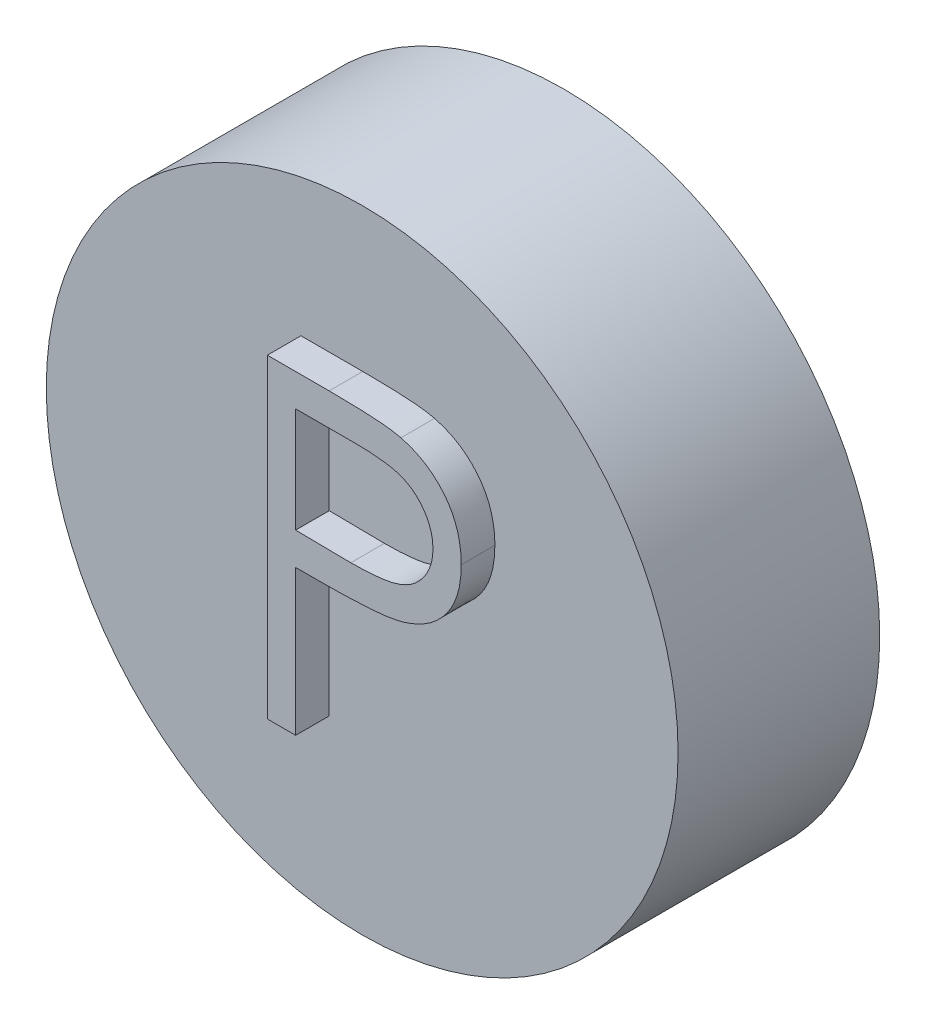
ISO-10303-21;
HEADER;
FILE_DESCRIPTION(('STEP AP214'),'2;1');
FILE_NAME('part.step','',(''),(''),'','','');
FILE_SCHEMA(('AUTOMOTIVE_DESIGN { 1 0 10303 214 1 1 1 1 }'));
ENDSEC;
DATA;
#1=APPLICATION_CONTEXT('core data for automotive mechanical design processes');
#2=APPLICATION_PROTOCOL_DEFINITION('international standard','automotive_design',2000,#1);
#3=PRODUCT_CONTEXT('',#1,'mechanical');
#4=PRODUCT('Part','Part','',(#3));
#5=PRODUCT_RELATED_PRODUCT_CATEGORY('part','',(#4));
#6=PRODUCT_DEFINITION_FORMATION('','',#4);
#7=PRODUCT_DEFINITION_CONTEXT('part definition',#1,'design');
#8=PRODUCT_DEFINITION('design','',#6,#7);
#9=PRODUCT_DEFINITION_SHAPE('','',#8);
#10=(LENGTH_UNIT() NAMED_UNIT(*) SI_UNIT(.MILLI.,.METRE.));
#11=(NAMED_UNIT(*) PLANE_ANGLE_UNIT() SI_UNIT($,.RADIAN.));
#12=(NAMED_UNIT(*) SI_UNIT($,.STERADIAN.) SOLID_ANGLE_UNIT());
#13=UNCERTAINTY_MEASURE_WITH_UNIT(LENGTH_MEASURE(1.E-05),#10,'distance_accuracy_value','');
#14=(GEOMETRIC_REPRESENTATION_CONTEXT(3) GLOBAL_UNCERTAINTY_ASSIGNED_CONTEXT((#13)) GLOBAL_UNIT_ASSIGNED_CONTEXT((#10,
#11,#12)) REPRESENTATION_CONTEXT('',''));
#15=CARTESIAN_POINT('',(0.,0.,0.));
#16=DIRECTION('',(0.,0.,1.));
#17=DIRECTION('',(1.,0.,0.));
#18=AXIS2_PLACEMENT_3D('',#15,#16,#17);
#19=CARTESIAN_POINT('',(0.,0.,7.62));
#20=DIRECTION('',(0.,0.,1.));
#21=DIRECTION('',(1.,0.,0.));
#22=AXIS2_PLACEMENT_3D('',#19,#20,#21);
#23=PLANE('',#22);
#24=CARTESIAN_POINT('',(0.,0.,7.62));
#25=DIRECTION('',(0.,0.,1.));
#26=DIRECTION('',(1.,0.,0.));
#27=AXIS2_PLACEMENT_3D('',#24,#25,#26);
#28=CIRCLE('',#27,11.938);
#29=CARTESIAN_POINT('',(11.938,0.,7.62));
#30=VERTEX_POINT('',#29);
#31=EDGE_CURVE('E313',#30,#30,#28,.T.);
#32=ORIENTED_EDGE('',*,*,#31,.T.);
#33=EDGE_LOOP('',(#32));
#34=FACE_BOUND('',#33,.T.);
#35=DIRECTION('',(-1.,0.,0.));
#36=VECTOR('',#35,1.);
#37=CARTESIAN_POINT('',(-1.24460796235766,-5.39100995542121,7.62));
#38=LINE('',#37,#36);
#39=CARTESIAN_POINT('',(-1.24460796235766,-5.39100995542121,7.62));
#40=VERTEX_POINT('',#39);
#41=CARTESIAN_POINT('',(-2.31311757774228,-5.39100995542121,7.62));
#42=VERTEX_POINT('',#41);
#43=EDGE_CURVE('E305',#40,#42,#38,.T.);
#44=ORIENTED_EDGE('',*,*,#43,.T.);
#45=DIRECTION('',(0.,1.,0.));
#46=VECTOR('',#45,1.);
#47=CARTESIAN_POINT('',(-2.31311757774228,-5.39100995542121,7.62));
#48=LINE('',#47,#46);
#49=CARTESIAN_POINT('',(-2.31311757774228,6.51524004457879,7.62));
#50=VERTEX_POINT('',#49);
#51=EDGE_CURVE('E55',#42,#50,#48,.T.);
#52=ORIENTED_EDGE('',*,*,#51,.T.);
#53=DIRECTION('',(1.,0.,0.));
#54=VECTOR('',#53,1.);
#55=CARTESIAN_POINT('',(-2.31311757774228,6.51524004457879,7.62));
#56=LINE('',#55,#54);
#57=CARTESIAN_POINT('',(0.0218621398057985,6.51524004457879,7.62));
#58=VERTEX_POINT('',#57);
#59=EDGE_CURVE('E257',#50,#58,#56,.T.);
#60=ORIENTED_EDGE('',*,*,#59,.T.);
#61=CARTESIAN_POINT('',(0.0218621398057985,6.51524004457879,7.62));
#62=CARTESIAN_POINT('',(0.182463525911005,6.51506350468806,7.62));
#63=CARTESIAN_POINT('',(0.490182913954527,6.51472524641733,7.62));
#64=CARTESIAN_POINT('',(0.931445737392795,6.50446972713545,7.62));
#65=CARTESIAN_POINT('',(1.3322091994431,6.49077178349845,7.62));
#66=CARTESIAN_POINT('',(1.69160915598847,6.47178337897543,7.62));
#67=CARTESIAN_POINT('',(2.01075141822943,6.44934319250846,7.62));
#68=CARTESIAN_POINT('',(2.28819187472264,6.41786973712632,7.62));
#69=CARTESIAN_POINT('',(2.52611125832258,6.38500748171723,7.62));
#70=CARTESIAN_POINT('',(2.66866801938618,6.35159716132536,7.62));
#71=CARTESIAN_POINT('',(2.73368230206541,6.3363600866461,7.62));
#72=B_SPLINE_CURVE_WITH_KNOTS('',3,(#61,#62,#63,#64,#65,#66,#67,#68,#69,#70,#71),.UNSPECIFIED.,
.F.,.F.,(4,1,1,1,1,1,1,1,4),(0.,0.176955752131251,0.339055079642581,0.486318224942077,
0.618780922835378,0.735618827767381,0.838742476720111,0.926457067876318,1.),.UNSPECIFIED.);
#73=CARTESIAN_POINT('',(2.73368230206541,6.3363600866461,7.62));
#74=VERTEX_POINT('',#73);
#75=EDGE_CURVE('E261',#58,#74,#72,.T.);
#76=ORIENTED_EDGE('',*,*,#75,.T.);
#77=CARTESIAN_POINT('',(2.73368230206541,6.3363600866461,7.62));
#78=CARTESIAN_POINT('',(2.81598351967431,6.31383363230791,7.62));
#79=CARTESIAN_POINT('',(2.9786466296549,6.26931153134824,7.62));
#80=CARTESIAN_POINT('',(3.21303321377739,6.18013806131056,7.62));
#81=CARTESIAN_POINT('',(3.43603334884902,6.0744031958475,7.62));
#82=CARTESIAN_POINT('',(3.64841213248843,5.953898543319,7.62));
#83=CARTESIAN_POINT('',(3.84755975436346,5.81345390086096,7.62));
#84=CARTESIAN_POINT('',(4.03644744729247,5.65876239765856,7.62));
#85=CARTESIAN_POINT('',(4.21340827311979,5.48625250813984,7.62));
#86=CARTESIAN_POINT('',(4.37744711515436,5.29785909848027,7.62));
#87=CARTESIAN_POINT('',(4.52809450693546,5.09674481307982,7.62));
#88=CARTESIAN_POINT('',(4.65780351692702,4.87990740598382,7.62));
#89=CARTESIAN_POINT('',(4.76641310174553,4.65099681131455,7.62));
#90=CARTESIAN_POINT('',(4.85956512349074,4.41017225228824,7.62));
#91=CARTESIAN_POINT('',(4.92660906235471,4.15541141969717,7.62));
#92=CARTESIAN_POINT('',(4.97711503367415,3.88848447849569,7.62));
#93=CARTESIAN_POINT('',(5.00917219547381,3.60942004129239,7.62));
#94=CARTESIAN_POINT('',(5.01224251715872,3.41871638481517,7.62));
#95=CARTESIAN_POINT('',(5.0138054991808,3.32163652895379,7.62));
#96=B_SPLINE_CURVE_WITH_KNOTS('',3,(#77,#78,#79,#80,#81,#82,#83,#84,#85,#86,#87,#88,#89,#90,#91,
#92,#93,#94,#95),.UNSPECIFIED.,.F.,.F.,(4,1,1,1,1,1,1,1,1,1,1,1,1,1,1,1,4),(0.,
0.0624813386352054,0.123490382687291,0.183411094206311,0.24315322099978,0.302126735372088,
0.361709670832907,0.42184229169488,0.482931901446669,0.544552254431324,0.605680719965358,
0.667679738343688,0.729984387538063,0.79455092128613,0.860345619712083,0.928907356265709,1.),.UNSPECIFIED.);
#97=CARTESIAN_POINT('',(5.0138054991808,3.32163652895379,7.62));
#98=VERTEX_POINT('',#97);
#99=EDGE_CURVE('E267',#74,#98,#96,.T.);
#100=ORIENTED_EDGE('',*,*,#99,.T.);
#101=CARTESIAN_POINT('',(5.0138054991808,3.32163652895379,7.62));
#102=CARTESIAN_POINT('',(5.01237190255818,3.22374069898922,7.62));
#103=CARTESIAN_POINT('',(5.00956697394041,3.03220089574615,7.62));
#104=CARTESIAN_POINT('',(4.97590193188427,2.75198632163997,7.62));
#105=CARTESIAN_POINT('',(4.93055547646704,2.48420322663874,7.62));
#106=CARTESIAN_POINT('',(4.86082889667541,2.22944536388116,7.62));
#107=CARTESIAN_POINT('',(4.76950566943887,1.98922564469042,7.62));
#108=CARTESIAN_POINT('',(4.66237645395488,1.75987306076273,7.62));
#109=CARTESIAN_POINT('',(4.53316462296484,1.54528953403625,7.62));
#110=CARTESIAN_POINT('',(4.38469426475322,1.34469603597045,7.62));
#111=CARTESIAN_POINT('',(4.21953214454168,1.15790428068743,7.62));
#112=CARTESIAN_POINT('',(4.03837706030859,0.986267881564923,7.62));
#113=CARTESIAN_POINT('',(3.84196035992822,0.830791516038288,7.62));
#114=CARTESIAN_POINT('',(3.63090626691845,0.691126632625541,7.62));
#115=CARTESIAN_POINT('',(3.40315722757272,0.570511967548589,7.62));
#116=CARTESIAN_POINT('',(3.16216740158584,0.462480421328694,7.62));
#117=CARTESIAN_POINT('',(2.90584211179341,0.371751188263816,7.62));
#118=CARTESIAN_POINT('',(2.72846445264505,0.324023925732946,7.62));
#119=CARTESIAN_POINT('',(2.63827965783464,0.299757772944173,7.62));
#120=B_SPLINE_CURVE_WITH_KNOTS('',3,(#101,#102,#103,#104,#105,#106,#107,#108,#109,#110,#111,
#112,#113,#114,#115,#116,#117,#118,#119),.UNSPECIFIED.,.F.,.F.,(4,1,1,1,1,1,1,1,1,1,1,1,1,1,1,1,
4),(0.,0.0701188944197149,0.137192352785971,0.202016180724751,0.264631406974743,
0.326116547145818,0.386010304667641,0.44581184695768,0.50529769673096,0.564633277726488,
0.62428262533384,0.683902031903751,0.74395277093827,0.805387731007634,0.86838803089628,
0.933084028252477,1.),.UNSPECIFIED.);
#121=CARTESIAN_POINT('',(2.63827965783464,0.299757772944173,7.62));
#122=VERTEX_POINT('',#121);
#123=EDGE_CURVE('E276',#98,#122,#120,.T.);
#124=ORIENTED_EDGE('',*,*,#123,.T.);
#125=CARTESIAN_POINT('',(2.63827965783465,0.299757772944173,7.62));
#126=CARTESIAN_POINT('',(2.56368756631028,0.283895310527416,7.62));
#127=CARTESIAN_POINT('',(2.40021466073535,0.249131801851788,7.62));
#128=CARTESIAN_POINT('',(2.13098807904141,0.210322676334818,7.62));
#129=CARTESIAN_POINT('',(1.81752922154801,0.177197445431641,7.62));
#130=CARTESIAN_POINT('',(1.46026593004951,0.152360539910368,7.62));
#131=CARTESIAN_POINT('',(1.05951888741451,0.131098125767283,7.62));
#132=CARTESIAN_POINT('',(0.615071306676725,0.114197734942748,7.62));
#133=CARTESIAN_POINT('',(0.126050740557823,0.104911357164217,7.62));
#134=CARTESIAN_POINT('',(-0.215050545100232,0.104432410233636,7.62));
#135=CARTESIAN_POINT('',(-0.393139362598047,0.104182352271096,7.62));
#136=B_SPLINE_CURVE_WITH_KNOTS('',3,(#125,#126,#127,#128,#129,#130,#131,#132,#133,#134,#135),
.UNSPECIFIED.,.F.,.F.,(4,1,1,1,1,1,1,1,4),(0.,0.0751731173762219,0.164746257511801,
0.26801688098778,0.385911875652956,0.517789479273397,0.663690977002281,0.824413220536641,1.),.UNSPECIFIED.);
#137=CARTESIAN_POINT('',(-0.393139362598047,0.104182352271096,7.62));
#138=VERTEX_POINT('',#137);
#139=EDGE_CURVE('E285',#122,#138,#136,.T.);
#140=ORIENTED_EDGE('',*,*,#139,.T.);
#141=DIRECTION('',(-1.,0.,0.));
#142=VECTOR('',#141,1.);
#143=CARTESIAN_POINT('',(-0.393139362598047,0.104182352271096,7.62));
#144=LINE('',#143,#142);
#145=CARTESIAN_POINT('',(-1.24460796235766,0.104182352271096,7.62));
#146=VERTEX_POINT('',#145);
#147=EDGE_CURVE('E294',#138,#146,#144,.T.);
#148=ORIENTED_EDGE('',*,*,#147,.T.);
#149=DIRECTION('',(0.,-1.,0.));
#150=VECTOR('',#149,1.);
#151=CARTESIAN_POINT('',(-1.24460796235766,0.104182352271096,7.62));
#152=LINE('',#151,#150);
#153=EDGE_CURVE('E301',#146,#40,#152,.T.);
#154=ORIENTED_EDGE('',*,*,#153,.T.);
#155=EDGE_LOOP('',(#44,#52,#60,#76,#100,#124,#140,#148,#154));
#156=FACE_BOUND('',#155,.T.);
#157=ADVANCED_FACE('F39',(#34,#156),#23,.T.);
#158=CARTESIAN_POINT('',(0.,0.,0.));
#159=DIRECTION('',(0.,0.,1.));
#160=DIRECTION('',(1.,0.,0.));
#161=AXIS2_PLACEMENT_3D('',#158,#159,#160);
#162=PLANE('',#161);
#163=CARTESIAN_POINT('',(0.,0.,0.));
#164=DIRECTION('',(0.,0.,1.));
#165=DIRECTION('',(1.,0.,0.));
#166=AXIS2_PLACEMENT_3D('',#163,#164,#165);
#167=CIRCLE('',#166,11.938);
#168=CARTESIAN_POINT('',(11.938,0.,0.));
#169=VERTEX_POINT('',#168);
#170=EDGE_CURVE('E11',#169,#169,#167,.T.);
#171=ORIENTED_EDGE('',*,*,#170,.F.);
#172=EDGE_LOOP('',(#171));
#173=FACE_BOUND('',#172,.T.);
#174=CARTESIAN_POINT('',(0.,0.,0.));
#175=DIRECTION('',(0.,0.,1.));
#176=DIRECTION('',(1.,0.,0.));
#177=AXIS2_PLACEMENT_3D('',#174,#175,#176);
#178=CIRCLE('',#177,8.763);
#179=CARTESIAN_POINT('',(8.763,0.,0.));
#180=VERTEX_POINT('',#179);
#181=EDGE_CURVE('E48',#180,#180,#178,.T.);
#182=ORIENTED_EDGE('',*,*,#181,.T.);
#183=EDGE_LOOP('',(#182));
#184=FACE_BOUND('',#183,.T.);
#185=ADVANCED_FACE('F347',(#173,#184),#162,.F.);
#186=CARTESIAN_POINT('',(0.,0.,5.08));
#187=DIRECTION('',(0.,0.,-1.));
#188=DIRECTION('',(-1.,0.,0.));
#189=AXIS2_PLACEMENT_3D('',#186,#187,#188);
#190=CYLINDRICAL_SURFACE('',#189,11.938);
#191=ORIENTED_EDGE('',*,*,#170,.T.);
#192=EDGE_LOOP('',(#191));
#193=FACE_BOUND('',#192,.T.);
#194=ORIENTED_EDGE('',*,*,#31,.F.);
#195=EDGE_LOOP('',(#194));
#196=FACE_BOUND('',#195,.T.);
#197=ADVANCED_FACE('F41',(#193,#196),#190,.T.);
#198=CARTESIAN_POINT('',(0.,0.,5.08));
#199=DIRECTION('',(0.,0.,-1.));
#200=DIRECTION('',(-1.,0.,0.));
#201=AXIS2_PLACEMENT_3D('',#198,#199,#200);
#202=CYLINDRICAL_SURFACE('',#201,8.763);
#203=CARTESIAN_POINT('',(0.,0.,5.08));
#204=DIRECTION('',(0.,0.,1.));
#205=DIRECTION('',(1.,0.,0.));
#206=AXIS2_PLACEMENT_3D('',#203,#204,#205);
#207=CIRCLE('',#206,8.763);
#208=CARTESIAN_POINT('',(8.763,0.,5.08));
#209=VERTEX_POINT('',#208);
#210=EDGE_CURVE('E340',#209,#209,#207,.T.);
#211=ORIENTED_EDGE('',*,*,#210,.T.);
#212=EDGE_LOOP('',(#211));
#213=FACE_BOUND('',#212,.T.);
#214=ORIENTED_EDGE('',*,*,#181,.F.);
#215=EDGE_LOOP('',(#214));
#216=FACE_BOUND('',#215,.T.);
#217=ADVANCED_FACE('F349',(#213,#216),#202,.F.);
#218=CARTESIAN_POINT('',(0.,0.,5.08));
#219=DIRECTION('',(0.,0.,1.));
#220=DIRECTION('',(1.,0.,0.));
#221=AXIS2_PLACEMENT_3D('',#218,#219,#220);
#222=PLANE('',#221);
#223=ORIENTED_EDGE('',*,*,#210,.F.);
#224=EDGE_LOOP('',(#223));
#225=FACE_BOUND('',#224,.T.);
#226=ADVANCED_FACE('F205',(#225),#222,.F.);
#227=CARTESIAN_POINT('',(1.38278616718824,6.48733310506139,8.89));
#228=DIRECTION('',(0.,1.77547699850606E-13,1.));
#229=DIRECTION('',(0.,-1.,1.77547699850606E-13));
#230=AXIS2_PLACEMENT_3D('',#227,#228,#229);
#231=PLANE('',#230);
#232=DIRECTION('',(0.,1.,0.));
#233=VECTOR('',#232,1.);
#234=CARTESIAN_POINT('',(-2.31311757774228,-5.39100995542121,8.89));
#235=LINE('',#234,#233);
#236=CARTESIAN_POINT('',(-2.31311757774228,-5.39100995542121,8.89));
#237=VERTEX_POINT('',#236);
#238=CARTESIAN_POINT('',(-2.31311757774228,6.51524004457879,8.89));
#239=VERTEX_POINT('',#238);
#240=EDGE_CURVE('E309',#237,#239,#235,.T.);
#241=ORIENTED_EDGE('',*,*,#240,.F.);
#242=DIRECTION('',(-1.,0.,0.));
#243=VECTOR('',#242,1.);
#244=CARTESIAN_POINT('',(-1.24460796235766,-5.39100995542121,8.89));
#245=LINE('',#244,#243);
#246=CARTESIAN_POINT('',(-1.24460796235766,-5.39100995542121,8.89));
#247=VERTEX_POINT('',#246);
#248=EDGE_CURVE('E250',#247,#237,#245,.T.);
#249=ORIENTED_EDGE('',*,*,#248,.F.);
#250=DIRECTION('',(0.,-1.,0.));
#251=VECTOR('',#250,1.);
#252=CARTESIAN_POINT('',(-1.24460796235766,0.104182352271096,8.89));
#253=LINE('',#252,#251);
#254=CARTESIAN_POINT('',(-1.24460796235766,0.104182352271096,8.89));
#255=VERTEX_POINT('',#254);
#256=EDGE_CURVE('E246',#255,#247,#253,.T.);
#257=ORIENTED_EDGE('',*,*,#256,.F.);
#258=DIRECTION('',(-1.,0.,0.));
#259=VECTOR('',#258,1.);
#260=CARTESIAN_POINT('',(-0.393139362598047,0.104182352271096,8.89));
#261=LINE('',#260,#259);
#262=CARTESIAN_POINT('',(-0.393139362598047,0.104182352271096,8.89));
#263=VERTEX_POINT('',#262);
#264=EDGE_CURVE('E234',#263,#255,#261,.T.);
#265=ORIENTED_EDGE('',*,*,#264,.F.);
#266=CARTESIAN_POINT('',(2.63827965783465,0.299757772944173,8.89));
#267=CARTESIAN_POINT('',(2.56368756631028,0.283895310527416,8.89));
#268=CARTESIAN_POINT('',(2.40021466073535,0.249131801851788,8.89));
#269=CARTESIAN_POINT('',(2.13098807904141,0.210322676334818,8.89));
#270=CARTESIAN_POINT('',(1.81752922154801,0.177197445431641,8.89));
#271=CARTESIAN_POINT('',(1.46026593004951,0.152360539910368,8.89));
#272=CARTESIAN_POINT('',(1.05951888741451,0.131098125767283,8.89));
#273=CARTESIAN_POINT('',(0.615071306676725,0.114197734942748,8.89));
#274=CARTESIAN_POINT('',(0.126050740557823,0.104911357164217,8.89));
#275=CARTESIAN_POINT('',(-0.215050545100232,0.104432410233636,8.89));
#276=CARTESIAN_POINT('',(-0.393139362598047,0.104182352271096,8.89));
#277=B_SPLINE_CURVE_WITH_KNOTS('',3,(#266,#267,#268,#269,#270,#271,#272,#273,#274,#275,#276),
.UNSPECIFIED.,.F.,.F.,(4,1,1,1,1,1,1,1,4),(0.,0.0751731173762219,0.164746257511801,
0.26801688098778,0.385911875652956,0.517789479273397,0.663690977002281,0.824413220536641,1.),.UNSPECIFIED.);
#278=CARTESIAN_POINT('',(2.63827965783464,0.299757772944173,8.89));
#279=VERTEX_POINT('',#278);
#280=EDGE_CURVE('E227',#279,#263,#277,.T.);
#281=ORIENTED_EDGE('',*,*,#280,.F.);
#282=CARTESIAN_POINT('',(5.0138054991808,3.32163652895379,8.89));
#283=CARTESIAN_POINT('',(5.01237190255818,3.22374069898922,8.89));
#284=CARTESIAN_POINT('',(5.00956697394041,3.03220089574615,8.89));
#285=CARTESIAN_POINT('',(4.97590193188427,2.75198632163997,8.89));
#286=CARTESIAN_POINT('',(4.93055547646704,2.48420322663874,8.89));
#287=CARTESIAN_POINT('',(4.86082889667541,2.22944536388116,8.89));
#288=CARTESIAN_POINT('',(4.76950566943887,1.98922564469042,8.89));
#289=CARTESIAN_POINT('',(4.66237645395488,1.75987306076273,8.89));
#290=CARTESIAN_POINT('',(4.53316462296484,1.54528953403625,8.89));
#291=CARTESIAN_POINT('',(4.38469426475322,1.34469603597045,8.89));
#292=CARTESIAN_POINT('',(4.21953214454168,1.15790428068743,8.89));
#293=CARTESIAN_POINT('',(4.03837706030859,0.986267881564923,8.89));
#294=CARTESIAN_POINT('',(3.84196035992822,0.830791516038288,8.89));
#295=CARTESIAN_POINT('',(3.63090626691845,0.691126632625541,8.89));
#296=CARTESIAN_POINT('',(3.40315722757272,0.570511967548589,8.89));
#297=CARTESIAN_POINT('',(3.16216740158584,0.462480421328694,8.89));
#298=CARTESIAN_POINT('',(2.90584211179341,0.371751188263816,8.89));
#299=CARTESIAN_POINT('',(2.72846445264505,0.324023925732946,8.89));
#300=CARTESIAN_POINT('',(2.63827965783464,0.299757772944173,8.89));
#301=B_SPLINE_CURVE_WITH_KNOTS('',3,(#282,#283,#284,#285,#286,#287,#288,#289,#290,#291,#292,
#293,#294,#295,#296,#297,#298,#299,#300),.UNSPECIFIED.,.F.,.F.,(4,1,1,1,1,1,1,1,1,1,1,1,1,1,1,1,
4),(0.,0.0701188944197149,0.137192352785971,0.202016180724751,0.264631406974743,
0.326116547145818,0.386010304667641,0.44581184695768,0.50529769673096,0.564633277726488,
0.62428262533384,0.683902031903751,0.74395277093827,0.805387731007634,0.86838803089628,
0.933084028252477,1.),.UNSPECIFIED.);
#302=CARTESIAN_POINT('',(5.0138054991808,3.32163652895379,8.89));
#303=VERTEX_POINT('',#302);
#304=EDGE_CURVE('E235',#303,#279,#301,.T.);
#305=ORIENTED_EDGE('',*,*,#304,.F.);
#306=CARTESIAN_POINT('',(2.73368230206541,6.3363600866461,8.89));
#307=CARTESIAN_POINT('',(2.81598351967431,6.31383363230791,8.89));
#308=CARTESIAN_POINT('',(2.9786466296549,6.26931153134824,8.89));
#309=CARTESIAN_POINT('',(3.21303321377739,6.18013806131056,8.89));
#310=CARTESIAN_POINT('',(3.43603334884902,6.0744031958475,8.89));
#311=CARTESIAN_POINT('',(3.64841213248843,5.953898543319,8.89));
#312=CARTESIAN_POINT('',(3.84755975436346,5.81345390086096,8.89));
#313=CARTESIAN_POINT('',(4.03644744729247,5.65876239765856,8.89));
#314=CARTESIAN_POINT('',(4.21340827311979,5.48625250813984,8.89));
#315=CARTESIAN_POINT('',(4.37744711515436,5.29785909848027,8.89));
#316=CARTESIAN_POINT('',(4.52809450693546,5.09674481307982,8.89));
#317=CARTESIAN_POINT('',(4.65780351692702,4.87990740598382,8.89));
#318=CARTESIAN_POINT('',(4.76641310174553,4.65099681131455,8.89));
#319=CARTESIAN_POINT('',(4.85956512349074,4.41017225228824,8.89));
#320=CARTESIAN_POINT('',(4.92660906235471,4.15541141969717,8.89));
#321=CARTESIAN_POINT('',(4.97711503367415,3.88848447849569,8.89));
#322=CARTESIAN_POINT('',(5.00917219547381,3.60942004129239,8.89));
#323=CARTESIAN_POINT('',(5.01224251715872,3.41871638481517,8.89));
#324=CARTESIAN_POINT('',(5.0138054991808,3.32163652895379,8.89));
#325=B_SPLINE_CURVE_WITH_KNOTS('',3,(#306,#307,#308,#309,#310,#311,#312,#313,#314,#315,#316,
#317,#318,#319,#320,#321,#322,#323,#324),.UNSPECIFIED.,.F.,.F.,(4,1,1,1,1,1,1,1,1,1,1,1,1,1,1,1,
4),(0.,0.0624813386352054,0.123490382687291,0.183411094206311,0.24315322099978,
0.302126735372088,0.361709670832907,0.42184229169488,0.482931901446669,0.544552254431324,
0.605680719965358,0.667679738343688,0.729984387538063,0.79455092128613,0.860345619712083,
0.928907356265709,1.),.UNSPECIFIED.);
#326=CARTESIAN_POINT('',(2.73368230206541,6.3363600866461,8.89));
#327=VERTEX_POINT('',#326);
#328=EDGE_CURVE('E418',#327,#303,#325,.T.);
#329=ORIENTED_EDGE('',*,*,#328,.F.);
#330=CARTESIAN_POINT('',(0.0218621398057985,6.51524004457879,8.89));
#331=CARTESIAN_POINT('',(0.182463525911005,6.51506350468806,8.89));
#332=CARTESIAN_POINT('',(0.490182913954527,6.51472524641733,8.89));
#333=CARTESIAN_POINT('',(0.931445737392795,6.50446972713545,8.89));
#334=CARTESIAN_POINT('',(1.3322091994431,6.49077178349845,8.89));
#335=CARTESIAN_POINT('',(1.69160915598847,6.47178337897543,8.89));
#336=CARTESIAN_POINT('',(2.01075141822943,6.44934319250846,8.89));
#337=CARTESIAN_POINT('',(2.28819187472264,6.41786973712632,8.89));
#338=CARTESIAN_POINT('',(2.52611125832258,6.38500748171723,8.89));
#339=CARTESIAN_POINT('',(2.66866801938618,6.35159716132536,8.89));
#340=CARTESIAN_POINT('',(2.73368230206541,6.3363600866461,8.89));
#341=B_SPLINE_CURVE_WITH_KNOTS('',3,(#330,#331,#332,#333,#334,#335,#336,#337,#338,#339,#340),
.UNSPECIFIED.,.F.,.F.,(4,1,1,1,1,1,1,1,4),(0.,0.176955752131251,0.339055079642581,
0.486318224942077,0.618780922835378,0.735618827767381,0.838742476720111,0.926457067876318,1.),.UNSPECIFIED.);
#342=CARTESIAN_POINT('',(0.0218621398057985,6.51524004457879,8.89));
#343=VERTEX_POINT('',#342);
#344=EDGE_CURVE('E412',#343,#327,#341,.T.);
#345=ORIENTED_EDGE('',*,*,#344,.F.);
#346=DIRECTION('',(1.,0.,0.));
#347=VECTOR('',#346,1.);
#348=CARTESIAN_POINT('',(-2.31311757774228,6.51524004457879,8.89));
#349=LINE('',#348,#347);
#350=EDGE_CURVE('E408',#239,#343,#349,.T.);
#351=ORIENTED_EDGE('',*,*,#350,.F.);
#352=EDGE_LOOP('',(#241,#249,#257,#265,#281,#305,#329,#345,#351));
#353=FACE_BOUND('',#352,.T.);
#354=DIRECTION('',(0.,-1.,0.));
#355=VECTOR('',#354,1.);
#356=CARTESIAN_POINT('',(-1.24460796235766,5.29408619842494,8.89));
#357=LINE('',#356,#355);
#358=CARTESIAN_POINT('',(-1.24460796235766,5.29408619842494,8.89));
#359=VERTEX_POINT('',#358);
#360=CARTESIAN_POINT('',(-1.24460796235766,1.32533619842494,8.89));
#361=VERTEX_POINT('',#360);
#362=EDGE_CURVE('E151',#359,#361,#357,.T.);
#363=ORIENTED_EDGE('',*,*,#362,.F.);
#364=DIRECTION('',(-1.,0.,0.));
#365=VECTOR('',#364,1.);
#366=CARTESIAN_POINT('',(0.932957392209645,5.29408619842494,8.89));
#367=LINE('',#366,#365);
#368=CARTESIAN_POINT('',(0.932957392209645,5.29408619842494,8.89));
#369=VERTEX_POINT('',#368);
#370=EDGE_CURVE('E142',#369,#359,#367,.T.);
#371=ORIENTED_EDGE('',*,*,#370,.F.);
#372=CARTESIAN_POINT('',(3.94529588379618,3.31686639674225,8.89));
#373=CARTESIAN_POINT('',(3.94100063098548,3.41258758981382,8.89));
#374=CARTESIAN_POINT('',(3.93246220000242,3.60286947464752,8.89));
#375=CARTESIAN_POINT('',(3.86899895121477,3.88174365136451,8.89));
#376=CARTESIAN_POINT('',(3.76235530316112,4.14788475289456,8.89));
#377=CARTESIAN_POINT('',(3.614525280749,4.39612355217718,8.89));
#378=CARTESIAN_POINT('',(3.43511125829363,4.62128367995184,8.89));
#379=CARTESIAN_POINT('',(3.2265840286138,4.81687658540675,8.89));
#380=CARTESIAN_POINT('',(2.98943445211265,4.9741129134474,8.89));
#381=CARTESIAN_POINT('',(2.76883466618879,5.07559934477016,8.89));
#382=CARTESIAN_POINT('',(2.57288777443469,5.1375638085204,8.89));
#383=CARTESIAN_POINT('',(2.40268976804431,5.18091902471867,8.89));
#384=CARTESIAN_POINT('',(2.2105205985863,5.21553425667687,8.89));
#385=CARTESIAN_POINT('',(1.99631770578766,5.24356327958176,8.89));
#386=CARTESIAN_POINT('',(1.76174133339091,5.26755764320767,8.89));
#387=CARTESIAN_POINT('',(1.50477617290119,5.28383851219116,8.89));
#388=CARTESIAN_POINT('',(1.22639565429631,5.2933684659958,8.89));
#389=CARTESIAN_POINT('',(1.03313826590751,5.2938411620029,8.89));
#390=CARTESIAN_POINT('',(0.932957392209645,5.29408619842494,8.89));
#391=B_SPLINE_CURVE_WITH_KNOTS('',3,(#372,#373,#374,#375,#376,#377,#378,#379,#380,#381,#382,
#383,#384,#385,#386,#387,#388,#389,#390),.UNSPECIFIED.,.F.,.F.,(4,1,1,1,1,1,1,1,1,1,1,1,1,1,1,1,
4),(0.,0.0700437554181561,0.139238316762646,0.208197455044138,0.279173374424568,
0.349986811686477,0.418353845662656,0.487609583757151,0.557411073108388,0.595330156763241,
0.63796405156522,0.685912777711293,0.738185164652479,0.796102647184943,0.858516543946927,
0.926657726468519,1.),.UNSPECIFIED.);
#392=CARTESIAN_POINT('',(3.94529588379618,3.31686639674225,8.89));
#393=VERTEX_POINT('',#392);
#394=EDGE_CURVE('E178',#393,#369,#391,.T.);
#395=ORIENTED_EDGE('',*,*,#394,.F.);
#396=CARTESIAN_POINT('',(0.839939814084645,1.29910047126148,8.89));
#397=CARTESIAN_POINT('',(0.941720990287313,1.29904786743804,8.89));
#398=CARTESIAN_POINT('',(1.1382074525586,1.29894631684141,8.89));
#399=CARTESIAN_POINT('',(1.42203960480738,1.31250319314128,8.89));
#400=CARTESIAN_POINT('',(1.68536941250794,1.32815321943712,8.89));
#401=CARTESIAN_POINT('',(1.92738801266183,1.35106738764267,8.89));
#402=CARTESIAN_POINT('',(2.14820450407382,1.38345666533441,8.89));
#403=CARTESIAN_POINT('',(2.34818707997709,1.41615373807383,8.89));
#404=CARTESIAN_POINT('',(2.52578506911064,1.46345680191347,8.89));
#405=CARTESIAN_POINT('',(2.73363146083197,1.52714867103852,8.89));
#406=CARTESIAN_POINT('',(2.96523641965926,1.63577658681384,8.89));
#407=CARTESIAN_POINT('',(3.21719834811761,1.7934489806568,8.89));
#408=CARTESIAN_POINT('',(3.4307304320447,1.99442888980179,8.89));
#409=CARTESIAN_POINT('',(3.61550963799253,2.22040213743925,8.89));
#410=CARTESIAN_POINT('',(3.76214659776512,2.47179114021897,8.89));
#411=CARTESIAN_POINT('',(3.86949332162742,2.74076671961732,8.89));
#412=CARTESIAN_POINT('',(3.93256636587306,3.02457038629383,8.89));
#413=CARTESIAN_POINT('',(3.94102386393387,3.21877200150654,8.89));
#414=CARTESIAN_POINT('',(3.94529588379618,3.31686639674225,8.89));
#415=B_SPLINE_CURVE_WITH_KNOTS('',3,(#396,#397,#398,#399,#400,#401,#402,#403,#404,#405,#406,
#407,#408,#409,#410,#411,#412,#413,#414),.UNSPECIFIED.,.F.,.F.,(4,1,1,1,1,1,1,1,1,1,1,1,1,1,1,1,
4),(0.,0.0725383714064937,0.140033830501251,0.202495680633623,0.260575055669416,
0.313228337846466,0.361583193753265,0.404878361295127,0.44412743730554,0.516399693337198,
0.586506670997766,0.655085373796048,0.724383783147037,0.793973528725663,0.861637682181777,
0.930110942306404,1.),.UNSPECIFIED.);
#416=CARTESIAN_POINT('',(0.839939814084645,1.29910047126148,8.89));
#417=VERTEX_POINT('',#416);
#418=EDGE_CURVE('E169',#417,#393,#415,.T.);
#419=ORIENTED_EDGE('',*,*,#418,.F.);
#420=DIRECTION('',(0.999920808071693,-0.0125848156622296,0.));
#421=VECTOR('',#420,1.);
#422=CARTESIAN_POINT('',(-1.24460796235766,1.32533619842494,8.89));
#423=LINE('',#422,#421);
#424=EDGE_CURVE('E165',#361,#417,#423,.T.);
#425=ORIENTED_EDGE('',*,*,#424,.F.);
#426=EDGE_LOOP('',(#363,#371,#395,#419,#425));
#427=FACE_BOUND('',#426,.T.);
#428=ADVANCED_FACE('F163',(#353,#427),#231,.T.);
#429=CARTESIAN_POINT('',(-2.31311757774228,-5.39100995542121,8.89));
#430=DIRECTION('',(-1.,0.,0.));
#431=DIRECTION('',(0.,0.,1.));
#432=AXIS2_PLACEMENT_3D('',#429,#430,#431);
#433=PLANE('',#432);
#434=ORIENTED_EDGE('',*,*,#51,.F.);
#435=DIRECTION('',(0.,0.,-1.));
#436=VECTOR('',#435,1.);
#437=CARTESIAN_POINT('',(-2.31311757774228,-5.39100995542121,8.89));
#438=LINE('',#437,#436);
#439=EDGE_CURVE('E310',#237,#42,#438,.T.);
#440=ORIENTED_EDGE('',*,*,#439,.F.);
#441=ORIENTED_EDGE('',*,*,#240,.T.);
#442=DIRECTION('',(0.,0.,-1.));
#443=VECTOR('',#442,1.);
#444=CARTESIAN_POINT('',(-2.31311757774228,6.51524004457879,8.89));
#445=LINE('',#444,#443);
#446=EDGE_CURVE('E254',#239,#50,#445,.T.);
#447=ORIENTED_EDGE('',*,*,#446,.T.);
#448=EDGE_LOOP('',(#434,#440,#441,#447));
#449=FACE_BOUND('',#448,.T.);
#450=ADVANCED_FACE('F204',(#449),#433,.T.);
#451=CARTESIAN_POINT('',(-1.24460796235766,-5.39100995542121,8.89));
#452=DIRECTION('',(0.,-1.,0.));
#453=DIRECTION('',(0.,0.,-1.));
#454=AXIS2_PLACEMENT_3D('',#451,#452,#453);
#455=PLANE('',#454);
#456=ORIENTED_EDGE('',*,*,#43,.F.);
#457=DIRECTION('',(0.,0.,-1.));
#458=VECTOR('',#457,1.);
#459=CARTESIAN_POINT('',(-1.24460796235766,-5.39100995542121,8.89));
#460=LINE('',#459,#458);
#461=EDGE_CURVE('E314',#247,#40,#460,.T.);
#462=ORIENTED_EDGE('',*,*,#461,.F.);
#463=ORIENTED_EDGE('',*,*,#248,.T.);
#464=ORIENTED_EDGE('',*,*,#439,.T.);
#465=EDGE_LOOP('',(#456,#462,#463,#464));
#466=FACE_BOUND('',#465,.T.);
#467=ADVANCED_FACE('F207',(#466),#455,.T.);
#468=CARTESIAN_POINT('',(-1.24460796235766,0.104182352271096,8.89));
#469=DIRECTION('',(1.,0.,0.));
#470=DIRECTION('',(0.,0.,-1.));
#471=AXIS2_PLACEMENT_3D('',#468,#469,#470);
#472=PLANE('',#471);
#473=ORIENTED_EDGE('',*,*,#153,.F.);
#474=DIRECTION('',(0.,0.,-1.));
#475=VECTOR('',#474,1.);
#476=CARTESIAN_POINT('',(-1.24460796235766,0.104182352271096,8.89));
#477=LINE('',#476,#475);
#478=EDGE_CURVE('E317',#255,#146,#477,.T.);
#479=ORIENTED_EDGE('',*,*,#478,.F.);
#480=ORIENTED_EDGE('',*,*,#256,.T.);
#481=ORIENTED_EDGE('',*,*,#461,.T.);
#482=EDGE_LOOP('',(#473,#479,#480,#481));
#483=FACE_BOUND('',#482,.T.);
#484=ADVANCED_FACE('F210',(#483),#472,.T.);
#485=CARTESIAN_POINT('',(-0.393139362598047,0.104182352271096,8.89));
#486=DIRECTION('',(0.,-1.,0.));
#487=DIRECTION('',(0.,0.,-1.));
#488=AXIS2_PLACEMENT_3D('',#485,#486,#487);
#489=PLANE('',#488);
#490=ORIENTED_EDGE('',*,*,#147,.F.);
#491=DIRECTION('',(0.,0.,-1.));
#492=VECTOR('',#491,1.);
#493=CARTESIAN_POINT('',(-0.393139362598047,0.104182352271096,8.89));
#494=LINE('',#493,#492);
#495=EDGE_CURVE('E320',#263,#138,#494,.T.);
#496=ORIENTED_EDGE('',*,*,#495,.F.);
#497=ORIENTED_EDGE('',*,*,#264,.T.);
#498=ORIENTED_EDGE('',*,*,#478,.T.);
#499=EDGE_LOOP('',(#490,#496,#497,#498));
#500=FACE_BOUND('',#499,.T.);
#501=ADVANCED_FACE('F214',(#500),#489,.T.);
#502=DIRECTION('',(0.,0.,-1.));
#503=VECTOR('',#502,1.);
#504=SURFACE_OF_LINEAR_EXTRUSION('',#277,#503);
#505=ORIENTED_EDGE('',*,*,#139,.F.);
#506=DIRECTION('',(0.,0.,-1.));
#507=VECTOR('',#506,1.);
#508=CARTESIAN_POINT('',(2.63827965783464,0.299757772944173,8.89));
#509=LINE('',#508,#507);
#510=EDGE_CURVE('E323',#279,#122,#509,.T.);
#511=ORIENTED_EDGE('',*,*,#510,.F.);
#512=ORIENTED_EDGE('',*,*,#280,.T.);
#513=ORIENTED_EDGE('',*,*,#495,.T.);
#514=EDGE_LOOP('',(#505,#511,#512,#513));
#515=FACE_BOUND('',#514,.T.);
#516=ADVANCED_FACE('F218',(#515),#504,.T.);
#517=DIRECTION('',(0.,0.,-1.));
#518=VECTOR('',#517,1.);
#519=SURFACE_OF_LINEAR_EXTRUSION('',#301,#518);
#520=ORIENTED_EDGE('',*,*,#123,.F.);
#521=DIRECTION('',(0.,0.,-1.));
#522=VECTOR('',#521,1.);
#523=CARTESIAN_POINT('',(5.0138054991808,3.32163652895379,8.89));
#524=LINE('',#523,#522);
#525=EDGE_CURVE('E326',#303,#98,#524,.T.);
#526=ORIENTED_EDGE('',*,*,#525,.F.);
#527=ORIENTED_EDGE('',*,*,#304,.T.);
#528=ORIENTED_EDGE('',*,*,#510,.T.);
#529=EDGE_LOOP('',(#520,#526,#527,#528));
#530=FACE_BOUND('',#529,.T.);
#531=ADVANCED_FACE('F223',(#530),#519,.T.);
#532=DIRECTION('',(0.,0.,-1.));
#533=VECTOR('',#532,1.);
#534=SURFACE_OF_LINEAR_EXTRUSION('',#325,#533);
#535=ORIENTED_EDGE('',*,*,#99,.F.);
#536=DIRECTION('',(0.,0.,-1.));
#537=VECTOR('',#536,1.);
#538=CARTESIAN_POINT('',(2.73368230206541,6.3363600866461,8.89));
#539=LINE('',#538,#537);
#540=EDGE_CURVE('E329',#327,#74,#539,.T.);
#541=ORIENTED_EDGE('',*,*,#540,.F.);
#542=ORIENTED_EDGE('',*,*,#328,.T.);
#543=ORIENTED_EDGE('',*,*,#525,.T.);
#544=EDGE_LOOP('',(#535,#541,#542,#543));
#545=FACE_BOUND('',#544,.T.);
#546=ADVANCED_FACE('F429',(#545),#534,.T.);
#547=DIRECTION('',(0.,0.,-1.));
#548=VECTOR('',#547,1.);
#549=SURFACE_OF_LINEAR_EXTRUSION('',#341,#548);
#550=ORIENTED_EDGE('',*,*,#75,.F.);
#551=DIRECTION('',(0.,0.,-1.));
#552=VECTOR('',#551,1.);
#553=CARTESIAN_POINT('',(0.0218621398057985,6.51524004457879,8.89));
#554=LINE('',#553,#552);
#555=EDGE_CURVE('E332',#343,#58,#554,.T.);
#556=ORIENTED_EDGE('',*,*,#555,.F.);
#557=ORIENTED_EDGE('',*,*,#344,.T.);
#558=ORIENTED_EDGE('',*,*,#540,.T.);
#559=EDGE_LOOP('',(#550,#556,#557,#558));
#560=FACE_BOUND('',#559,.T.);
#561=ADVANCED_FACE('F426',(#560),#549,.T.);
#562=CARTESIAN_POINT('',(-2.31311757774228,6.51524004457879,8.89));
#563=DIRECTION('',(0.,1.,0.));
#564=DIRECTION('',(0.,0.,1.));
#565=AXIS2_PLACEMENT_3D('',#562,#563,#564);
#566=PLANE('',#565);
#567=ORIENTED_EDGE('',*,*,#59,.F.);
#568=ORIENTED_EDGE('',*,*,#446,.F.);
#569=ORIENTED_EDGE('',*,*,#350,.T.);
#570=ORIENTED_EDGE('',*,*,#555,.T.);
#571=EDGE_LOOP('',(#567,#568,#569,#570));
#572=FACE_BOUND('',#571,.T.);
#573=ADVANCED_FACE('F201',(#572),#566,.T.);
#574=CARTESIAN_POINT('',(0.932957392209645,5.29408619842494,8.89));
#575=DIRECTION('',(0.,-1.,0.));
#576=DIRECTION('',(0.,0.,-1.));
#577=AXIS2_PLACEMENT_3D('',#574,#575,#576);
#578=PLANE('',#577);
#579=DIRECTION('',(-1.,0.,0.));
#580=VECTOR('',#579,1.);
#581=CARTESIAN_POINT('',(0.932957392209645,5.29408619842494,7.62));
#582=LINE('',#581,#580);
#583=CARTESIAN_POINT('',(0.932957392209645,5.29408619842494,7.62));
#584=VERTEX_POINT('',#583);
#585=CARTESIAN_POINT('',(-1.24460796235766,5.29408619842494,7.62));
#586=VERTEX_POINT('',#585);
#587=EDGE_CURVE('E377',#584,#586,#582,.T.);
#588=ORIENTED_EDGE('',*,*,#587,.F.);
#589=DIRECTION('',(0.,0.,-1.));
#590=VECTOR('',#589,1.);
#591=CARTESIAN_POINT('',(0.932957392209645,5.29408619842494,8.89));
#592=LINE('',#591,#590);
#593=EDGE_CURVE('E63',#369,#584,#592,.T.);
#594=ORIENTED_EDGE('',*,*,#593,.F.);
#595=ORIENTED_EDGE('',*,*,#370,.T.);
#596=DIRECTION('',(0.,0.,-1.));
#597=VECTOR('',#596,1.);
#598=CARTESIAN_POINT('',(-1.24460796235766,5.29408619842494,8.89));
#599=LINE('',#598,#597);
#600=EDGE_CURVE('E145',#359,#586,#599,.T.);
#601=ORIENTED_EDGE('',*,*,#600,.T.);
#602=EDGE_LOOP('',(#588,#594,#595,#601));
#603=FACE_BOUND('',#602,.T.);
#604=ADVANCED_FACE('F144',(#603),#578,.T.);
#605=CARTESIAN_POINT('',(-1.24460796235766,5.29408619842494,8.89));
#606=DIRECTION('',(1.,0.,0.));
#607=DIRECTION('',(0.,0.,-1.));
#608=AXIS2_PLACEMENT_3D('',#605,#606,#607);
#609=PLANE('',#608);
#610=DIRECTION('',(0.,-1.,0.));
#611=VECTOR('',#610,1.);
#612=CARTESIAN_POINT('',(-1.24460796235766,5.29408619842494,7.62));
#613=LINE('',#612,#611);
#614=CARTESIAN_POINT('',(-1.24460796235766,1.32533619842494,7.62));
#615=VERTEX_POINT('',#614);
#616=EDGE_CURVE('E158',#586,#615,#613,.T.);
#617=ORIENTED_EDGE('',*,*,#616,.F.);
#618=ORIENTED_EDGE('',*,*,#600,.F.);
#619=ORIENTED_EDGE('',*,*,#362,.T.);
#620=DIRECTION('',(0.,0.,-1.));
#621=VECTOR('',#620,1.);
#622=CARTESIAN_POINT('',(-1.24460796235766,1.32533619842494,8.89));
#623=LINE('',#622,#621);
#624=EDGE_CURVE('E160',#361,#615,#623,.T.);
#625=ORIENTED_EDGE('',*,*,#624,.T.);
#626=EDGE_LOOP('',(#617,#618,#619,#625));
#627=FACE_BOUND('',#626,.T.);
#628=ADVANCED_FACE('F155',(#627),#609,.T.);
#629=CARTESIAN_POINT('',(-1.24460796235766,1.32533619842494,8.89));
#630=DIRECTION('',(0.0125848156622296,0.999920808071693,0.));
#631=DIRECTION('',(-0.999920808071693,0.0125848156622296,0.));
#632=AXIS2_PLACEMENT_3D('',#629,#630,#631);
#633=PLANE('',#632);
#634=DIRECTION('',(0.999920808071693,-0.0125848156622296,0.));
#635=VECTOR('',#634,1.);
#636=CARTESIAN_POINT('',(-1.24460796235766,1.32533619842494,7.62));
#637=LINE('',#636,#635);
#638=CARTESIAN_POINT('',(0.839939814084645,1.29910047126148,7.62));
#639=VERTEX_POINT('',#638);
#640=EDGE_CURVE('E384',#615,#639,#637,.T.);
#641=ORIENTED_EDGE('',*,*,#640,.F.);
#642=ORIENTED_EDGE('',*,*,#624,.F.);
#643=ORIENTED_EDGE('',*,*,#424,.T.);
#644=DIRECTION('',(0.,0.,-1.));
#645=VECTOR('',#644,1.);
#646=CARTESIAN_POINT('',(0.839939814084645,1.29910047126148,8.89));
#647=LINE('',#646,#645);
#648=EDGE_CURVE('E400',#417,#639,#647,.T.);
#649=ORIENTED_EDGE('',*,*,#648,.T.);
#650=EDGE_LOOP('',(#641,#642,#643,#649));
#651=FACE_BOUND('',#650,.T.);
#652=ADVANCED_FACE('F192',(#651),#633,.T.);
#653=DIRECTION('',(0.,0.,-1.));
#654=VECTOR('',#653,1.);
#655=SURFACE_OF_LINEAR_EXTRUSION('',#415,#654);
#656=CARTESIAN_POINT('',(0.839939814084645,1.29910047126148,7.62));
#657=CARTESIAN_POINT('',(0.941720990287313,1.29904786743804,7.62));
#658=CARTESIAN_POINT('',(1.1382074525586,1.29894631684141,7.62));
#659=CARTESIAN_POINT('',(1.42203960480738,1.31250319314128,7.62));
#660=CARTESIAN_POINT('',(1.68536941250794,1.32815321943712,7.62));
#661=CARTESIAN_POINT('',(1.92738801266183,1.35106738764267,7.62));
#662=CARTESIAN_POINT('',(2.14820450407382,1.38345666533441,7.62));
#663=CARTESIAN_POINT('',(2.34818707997709,1.41615373807383,7.62));
#664=CARTESIAN_POINT('',(2.52578506911064,1.46345680191347,7.62));
#665=CARTESIAN_POINT('',(2.73363146083197,1.52714867103852,7.62));
#666=CARTESIAN_POINT('',(2.96523641965926,1.63577658681384,7.62));
#667=CARTESIAN_POINT('',(3.21719834811761,1.7934489806568,7.62));
#668=CARTESIAN_POINT('',(3.4307304320447,1.99442888980179,7.62));
#669=CARTESIAN_POINT('',(3.61550963799253,2.22040213743925,7.62));
#670=CARTESIAN_POINT('',(3.76214659776512,2.47179114021897,7.62));
#671=CARTESIAN_POINT('',(3.86949332162742,2.74076671961732,7.62));
#672=CARTESIAN_POINT('',(3.93256636587306,3.02457038629383,7.62));
#673=CARTESIAN_POINT('',(3.94102386393387,3.21877200150654,7.62));
#674=CARTESIAN_POINT('',(3.94529588379618,3.31686639674225,7.62));
#675=B_SPLINE_CURVE_WITH_KNOTS('',3,(#656,#657,#658,#659,#660,#661,#662,#663,#664,#665,#666,
#667,#668,#669,#670,#671,#672,#673,#674),.UNSPECIFIED.,.F.,.F.,(4,1,1,1,1,1,1,1,1,1,1,1,1,1,1,1,
4),(0.,0.0725383714064937,0.140033830501251,0.202495680633623,0.260575055669416,
0.313228337846466,0.361583193753265,0.404878361295127,0.44412743730554,0.516399693337198,
0.586506670997766,0.655085373796048,0.724383783147037,0.793973528725663,0.861637682181777,
0.930110942306404,1.),.UNSPECIFIED.);
#676=CARTESIAN_POINT('',(3.94529588379618,3.31686639674225,7.62));
#677=VERTEX_POINT('',#676);
#678=EDGE_CURVE('E380',#639,#677,#675,.T.);
#679=ORIENTED_EDGE('',*,*,#678,.F.);
#680=ORIENTED_EDGE('',*,*,#648,.F.);
#681=ORIENTED_EDGE('',*,*,#418,.T.);
#682=DIRECTION('',(0.,0.,-1.));
#683=VECTOR('',#682,1.);
#684=CARTESIAN_POINT('',(3.94529588379618,3.31686639674225,8.89));
#685=LINE('',#684,#683);
#686=EDGE_CURVE('E397',#393,#677,#685,.T.);
#687=ORIENTED_EDGE('',*,*,#686,.T.);
#688=EDGE_LOOP('',(#679,#680,#681,#687));
#689=FACE_BOUND('',#688,.T.);
#690=ADVANCED_FACE('F187',(#689),#655,.T.);
#691=DIRECTION('',(0.,0.,-1.));
#692=VECTOR('',#691,1.);
#693=SURFACE_OF_LINEAR_EXTRUSION('',#391,#692);
#694=CARTESIAN_POINT('',(3.94529588379618,3.31686639674225,7.62));
#695=CARTESIAN_POINT('',(3.94100063098548,3.41258758981382,7.62));
#696=CARTESIAN_POINT('',(3.93246220000242,3.60286947464752,7.62));
#697=CARTESIAN_POINT('',(3.86899895121477,3.88174365136451,7.62));
#698=CARTESIAN_POINT('',(3.76235530316112,4.14788475289456,7.62));
#699=CARTESIAN_POINT('',(3.614525280749,4.39612355217718,7.62));
#700=CARTESIAN_POINT('',(3.43511125829363,4.62128367995184,7.62));
#701=CARTESIAN_POINT('',(3.2265840286138,4.81687658540675,7.62));
#702=CARTESIAN_POINT('',(2.98943445211265,4.9741129134474,7.62));
#703=CARTESIAN_POINT('',(2.76883466618879,5.07559934477016,7.62));
#704=CARTESIAN_POINT('',(2.57288777443469,5.1375638085204,7.62));
#705=CARTESIAN_POINT('',(2.40268976804431,5.18091902471867,7.62));
#706=CARTESIAN_POINT('',(2.2105205985863,5.21553425667687,7.62));
#707=CARTESIAN_POINT('',(1.99631770578766,5.24356327958176,7.62));
#708=CARTESIAN_POINT('',(1.76174133339091,5.26755764320767,7.62));
#709=CARTESIAN_POINT('',(1.50477617290119,5.28383851219116,7.62));
#710=CARTESIAN_POINT('',(1.22639565429631,5.2933684659958,7.62));
#711=CARTESIAN_POINT('',(1.03313826590751,5.2938411620029,7.62));
#712=CARTESIAN_POINT('',(0.932957392209645,5.29408619842494,7.62));
#713=B_SPLINE_CURVE_WITH_KNOTS('',3,(#694,#695,#696,#697,#698,#699,#700,#701,#702,#703,#704,
#705,#706,#707,#708,#709,#710,#711,#712),.UNSPECIFIED.,.F.,.F.,(4,1,1,1,1,1,1,1,1,1,1,1,1,1,1,1,
4),(0.,0.0700437554181561,0.139238316762646,0.208197455044138,0.279173374424568,
0.349986811686477,0.418353845662656,0.487609583757151,0.557411073108388,0.595330156763241,
0.63796405156522,0.685912777711293,0.738185164652479,0.796102647184943,0.858516543946927,
0.926657726468519,1.),.UNSPECIFIED.);
#714=EDGE_CURVE('E152',#677,#584,#713,.T.);
#715=ORIENTED_EDGE('',*,*,#714,.F.);
#716=ORIENTED_EDGE('',*,*,#686,.F.);
#717=ORIENTED_EDGE('',*,*,#394,.T.);
#718=ORIENTED_EDGE('',*,*,#593,.T.);
#719=EDGE_LOOP('',(#715,#716,#717,#718));
#720=FACE_BOUND('',#719,.T.);
#721=ADVANCED_FACE('F191',(#720),#693,.T.);
#722=ORIENTED_EDGE('',*,*,#714,.T.);
#723=ORIENTED_EDGE('',*,*,#587,.T.);
#724=ORIENTED_EDGE('',*,*,#616,.T.);
#725=ORIENTED_EDGE('',*,*,#640,.T.);
#726=ORIENTED_EDGE('',*,*,#678,.T.);
#727=EDGE_LOOP('',(#722,#723,#724,#725,#726));
#728=FACE_BOUND('',#727,.T.);
#729=ADVANCED_FACE('F363',(#728),#23,.T.);
#730=CLOSED_SHELL('',(#157,#185,#197,#217,#226,#428,#450,#467,#484,#501,#516,#531,#546,#561,
#573,#604,#628,#652,#690,#721,#729));
#731=MANIFOLD_SOLID_BREP('B2',#730);
#732=ADVANCED_BREP_SHAPE_REPRESENTATION('',(#18,#731),#14);
#733=SHAPE_DEFINITION_REPRESENTATION(#9,#732);
ENDSEC;
END-ISO-10303-21;
